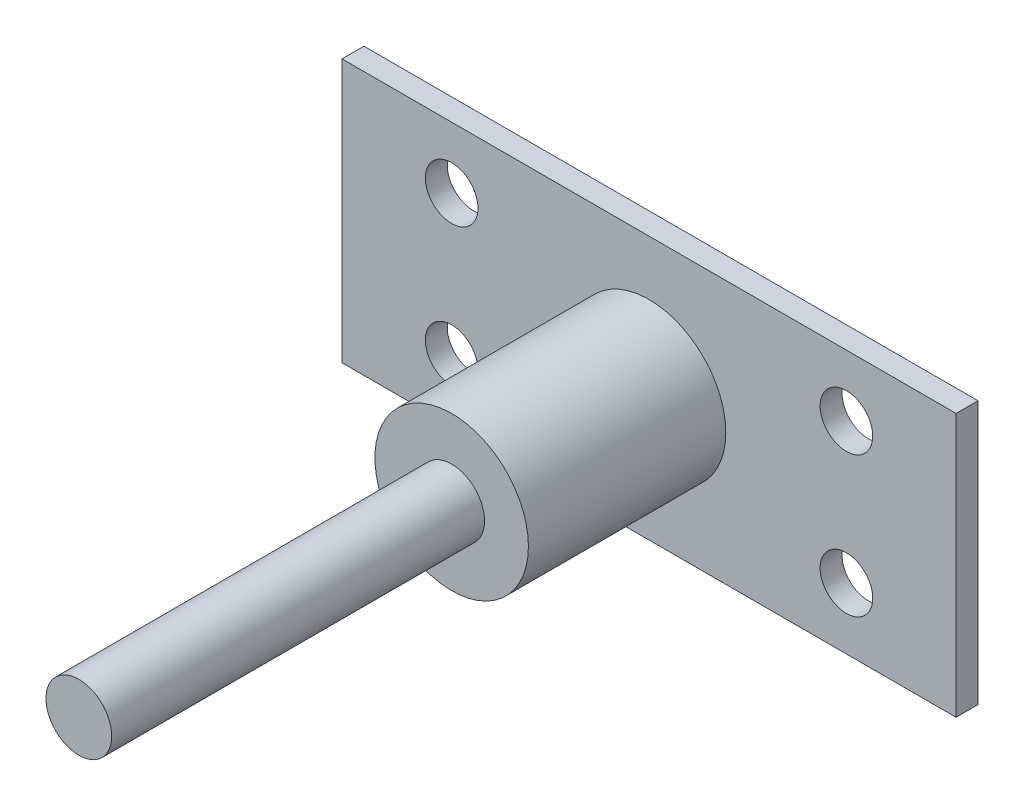
ISO-10303-21;
HEADER;
FILE_DESCRIPTION(('STEP AP214'),'2;1');
FILE_NAME('part.step','',(''),(''),'','','');
FILE_SCHEMA(('AUTOMOTIVE_DESIGN { 1 0 10303 214 1 1 1 1 }'));
ENDSEC;
DATA;
#1=APPLICATION_CONTEXT('core data for automotive mechanical design processes');
#2=APPLICATION_PROTOCOL_DEFINITION('international standard','automotive_design',2000,#1);
#3=PRODUCT_CONTEXT('',#1,'mechanical');
#4=PRODUCT('Part','Part','',(#3));
#5=PRODUCT_RELATED_PRODUCT_CATEGORY('part','',(#4));
#6=PRODUCT_DEFINITION_FORMATION('','',#4);
#7=PRODUCT_DEFINITION_CONTEXT('part definition',#1,'design');
#8=PRODUCT_DEFINITION('design','',#6,#7);
#9=PRODUCT_DEFINITION_SHAPE('','',#8);
#10=(LENGTH_UNIT() NAMED_UNIT(*) SI_UNIT(.MILLI.,.METRE.));
#11=(NAMED_UNIT(*) PLANE_ANGLE_UNIT() SI_UNIT($,.RADIAN.));
#12=(NAMED_UNIT(*) SI_UNIT($,.STERADIAN.) SOLID_ANGLE_UNIT());
#13=UNCERTAINTY_MEASURE_WITH_UNIT(LENGTH_MEASURE(1.E-05),#10,'distance_accuracy_value','');
#14=(GEOMETRIC_REPRESENTATION_CONTEXT(3) GLOBAL_UNCERTAINTY_ASSIGNED_CONTEXT((#13)) GLOBAL_UNIT_ASSIGNED_CONTEXT((#10,
#11,#12)) REPRESENTATION_CONTEXT('',''));
#15=CARTESIAN_POINT('',(0.,0.,0.));
#16=DIRECTION('',(0.,0.,1.));
#17=DIRECTION('',(1.,0.,0.));
#18=AXIS2_PLACEMENT_3D('',#15,#16,#17);
#19=CARTESIAN_POINT('',(0.,0.,5.));
#20=DIRECTION('',(0.,0.,1.));
#21=DIRECTION('',(1.,0.,0.));
#22=AXIS2_PLACEMENT_3D('',#19,#20,#21);
#23=PLANE('',#22);
#24=CARTESIAN_POINT('',(0.,0.,5.));
#25=DIRECTION('',(0.,0.,1.));
#26=DIRECTION('',(1.,0.,0.));
#27=AXIS2_PLACEMENT_3D('',#24,#25,#26);
#28=CIRCLE('',#27,17.5);
#29=CARTESIAN_POINT('',(17.5,0.,5.));
#30=VERTEX_POINT('',#29);
#31=EDGE_CURVE('E52',#30,#30,#28,.T.);
#32=ORIENTED_EDGE('',*,*,#31,.F.);
#33=EDGE_LOOP('',(#32));
#34=FACE_BOUND('',#33,.T.);
#35=CARTESIAN_POINT('',(45.,16.,5.));
#36=DIRECTION('',(0.,0.,1.));
#37=DIRECTION('',(1.,0.,0.));
#38=AXIS2_PLACEMENT_3D('',#35,#36,#37);
#39=CIRCLE('',#38,6.);
#40=CARTESIAN_POINT('',(51.,16.,5.));
#41=VERTEX_POINT('',#40);
#42=EDGE_CURVE('E151',#41,#41,#39,.T.);
#43=ORIENTED_EDGE('',*,*,#42,.F.);
#44=EDGE_LOOP('',(#43));
#45=FACE_BOUND('',#44,.T.);
#46=CARTESIAN_POINT('',(-45.,16.,5.));
#47=DIRECTION('',(0.,0.,1.));
#48=DIRECTION('',(1.,0.,0.));
#49=AXIS2_PLACEMENT_3D('',#46,#47,#48);
#50=CIRCLE('',#49,6.);
#51=CARTESIAN_POINT('',(-39.,16.,5.));
#52=VERTEX_POINT('',#51);
#53=EDGE_CURVE('E119',#52,#52,#50,.T.);
#54=ORIENTED_EDGE('',*,*,#53,.F.);
#55=EDGE_LOOP('',(#54));
#56=FACE_BOUND('',#55,.T.);
#57=DIRECTION('',(0.,1.,0.));
#58=VECTOR('',#57,1.);
#59=CARTESIAN_POINT('',(70.,30.,5.));
#60=LINE('',#59,#58);
#61=CARTESIAN_POINT('',(70.,-30.,5.));
#62=VERTEX_POINT('',#61);
#63=CARTESIAN_POINT('',(70.,30.,5.));
#64=VERTEX_POINT('',#63);
#65=EDGE_CURVE('E97',#62,#64,#60,.T.);
#66=ORIENTED_EDGE('',*,*,#65,.T.);
#67=DIRECTION('',(-1.,0.,0.));
#68=VECTOR('',#67,1.);
#69=CARTESIAN_POINT('',(-70.,30.,5.));
#70=LINE('',#69,#68);
#71=CARTESIAN_POINT('',(-70.,30.,5.));
#72=VERTEX_POINT('',#71);
#73=EDGE_CURVE('E92',#64,#72,#70,.T.);
#74=ORIENTED_EDGE('',*,*,#73,.T.);
#75=DIRECTION('',(0.,-1.,0.));
#76=VECTOR('',#75,1.);
#77=CARTESIAN_POINT('',(-70.,30.,5.));
#78=LINE('',#77,#76);
#79=CARTESIAN_POINT('',(-70.,-30.,5.));
#80=VERTEX_POINT('',#79);
#81=EDGE_CURVE('E95',#72,#80,#78,.T.);
#82=ORIENTED_EDGE('',*,*,#81,.T.);
#83=DIRECTION('',(1.,0.,0.));
#84=VECTOR('',#83,1.);
#85=CARTESIAN_POINT('',(-70.,-30.,5.));
#86=LINE('',#85,#84);
#87=EDGE_CURVE('E61',#80,#62,#86,.T.);
#88=ORIENTED_EDGE('',*,*,#87,.T.);
#89=EDGE_LOOP('',(#66,#74,#82,#88));
#90=FACE_BOUND('',#89,.T.);
#91=CARTESIAN_POINT('',(-45.,-16.,5.));
#92=DIRECTION('',(0.,0.,1.));
#93=DIRECTION('',(1.,0.,0.));
#94=AXIS2_PLACEMENT_3D('',#91,#92,#93);
#95=CIRCLE('',#94,5.99999999999999);
#96=CARTESIAN_POINT('',(-39.,-16.,5.));
#97=VERTEX_POINT('',#96);
#98=EDGE_CURVE('E143',#97,#97,#95,.T.);
#99=ORIENTED_EDGE('',*,*,#98,.F.);
#100=EDGE_LOOP('',(#99));
#101=FACE_BOUND('',#100,.T.);
#102=CARTESIAN_POINT('',(45.,-16.,5.));
#103=DIRECTION('',(0.,0.,1.));
#104=DIRECTION('',(1.,0.,0.));
#105=AXIS2_PLACEMENT_3D('',#102,#103,#104);
#106=CIRCLE('',#105,5.99999999999999);
#107=CARTESIAN_POINT('',(51.,-16.,5.));
#108=VERTEX_POINT('',#107);
#109=EDGE_CURVE('E159',#108,#108,#106,.T.);
#110=ORIENTED_EDGE('',*,*,#109,.F.);
#111=EDGE_LOOP('',(#110));
#112=FACE_BOUND('',#111,.T.);
#113=ADVANCED_FACE('F41',(#34,#45,#56,#90,#101,#112),#23,.T.);
#114=CARTESIAN_POINT('',(0.,0.,0.));
#115=DIRECTION('',(0.,0.,1.));
#116=DIRECTION('',(1.,0.,0.));
#117=AXIS2_PLACEMENT_3D('',#114,#115,#116);
#118=PLANE('',#117);
#119=DIRECTION('',(0.,1.,0.));
#120=VECTOR('',#119,1.);
#121=CARTESIAN_POINT('',(70.,30.,0.));
#122=LINE('',#121,#120);
#123=CARTESIAN_POINT('',(70.,-30.,0.));
#124=VERTEX_POINT('',#123);
#125=CARTESIAN_POINT('',(70.,30.,0.));
#126=VERTEX_POINT('',#125);
#127=EDGE_CURVE('E115',#124,#126,#122,.T.);
#128=ORIENTED_EDGE('',*,*,#127,.F.);
#129=DIRECTION('',(1.,0.,0.));
#130=VECTOR('',#129,1.);
#131=CARTESIAN_POINT('',(-70.,-30.,0.));
#132=LINE('',#131,#130);
#133=CARTESIAN_POINT('',(-70.,-30.,0.));
#134=VERTEX_POINT('',#133);
#135=EDGE_CURVE('E84',#134,#124,#132,.T.);
#136=ORIENTED_EDGE('',*,*,#135,.F.);
#137=DIRECTION('',(0.,-1.,0.));
#138=VECTOR('',#137,1.);
#139=CARTESIAN_POINT('',(-70.,30.,0.));
#140=LINE('',#139,#138);
#141=CARTESIAN_POINT('',(-70.,30.,0.));
#142=VERTEX_POINT('',#141);
#143=EDGE_CURVE('E78',#142,#134,#140,.T.);
#144=ORIENTED_EDGE('',*,*,#143,.F.);
#145=DIRECTION('',(-1.,0.,0.));
#146=VECTOR('',#145,1.);
#147=CARTESIAN_POINT('',(-70.,30.,0.));
#148=LINE('',#147,#146);
#149=EDGE_CURVE('E103',#126,#142,#148,.T.);
#150=ORIENTED_EDGE('',*,*,#149,.F.);
#151=EDGE_LOOP('',(#128,#136,#144,#150));
#152=FACE_BOUND('',#151,.T.);
#153=CARTESIAN_POINT('',(-45.,16.,0.));
#154=DIRECTION('',(0.,0.,1.));
#155=DIRECTION('',(1.,0.,0.));
#156=AXIS2_PLACEMENT_3D('',#153,#154,#155);
#157=CIRCLE('',#156,6.);
#158=CARTESIAN_POINT('',(-39.,16.,0.));
#159=VERTEX_POINT('',#158);
#160=EDGE_CURVE('E139',#159,#159,#157,.T.);
#161=ORIENTED_EDGE('',*,*,#160,.T.);
#162=EDGE_LOOP('',(#161));
#163=FACE_BOUND('',#162,.T.);
#164=CARTESIAN_POINT('',(-45.,-16.,0.));
#165=DIRECTION('',(0.,0.,1.));
#166=DIRECTION('',(1.,0.,0.));
#167=AXIS2_PLACEMENT_3D('',#164,#165,#166);
#168=CIRCLE('',#167,5.99999999999999);
#169=CARTESIAN_POINT('',(-39.,-16.,0.));
#170=VERTEX_POINT('',#169);
#171=EDGE_CURVE('E147',#170,#170,#168,.T.);
#172=ORIENTED_EDGE('',*,*,#171,.T.);
#173=EDGE_LOOP('',(#172));
#174=FACE_BOUND('',#173,.T.);
#175=CARTESIAN_POINT('',(45.,16.,0.));
#176=DIRECTION('',(0.,0.,1.));
#177=DIRECTION('',(1.,0.,0.));
#178=AXIS2_PLACEMENT_3D('',#175,#176,#177);
#179=CIRCLE('',#178,6.);
#180=CARTESIAN_POINT('',(51.,16.,0.));
#181=VERTEX_POINT('',#180);
#182=EDGE_CURVE('E155',#181,#181,#179,.T.);
#183=ORIENTED_EDGE('',*,*,#182,.T.);
#184=EDGE_LOOP('',(#183));
#185=FACE_BOUND('',#184,.T.);
#186=CARTESIAN_POINT('',(45.,-16.,0.));
#187=DIRECTION('',(0.,0.,1.));
#188=DIRECTION('',(1.,0.,0.));
#189=AXIS2_PLACEMENT_3D('',#186,#187,#188);
#190=CIRCLE('',#189,5.99999999999999);
#191=CARTESIAN_POINT('',(51.,-16.,0.));
#192=VERTEX_POINT('',#191);
#193=EDGE_CURVE('E163',#192,#192,#190,.T.);
#194=ORIENTED_EDGE('',*,*,#193,.T.);
#195=EDGE_LOOP('',(#194));
#196=FACE_BOUND('',#195,.T.);
#197=ADVANCED_FACE('F133',(#152,#163,#174,#185,#196),#118,.F.);
#198=CARTESIAN_POINT('',(70.,30.,5.));
#199=DIRECTION('',(-1.,0.,0.));
#200=DIRECTION('',(0.,-1.,0.));
#201=AXIS2_PLACEMENT_3D('',#198,#199,#200);
#202=PLANE('',#201);
#203=ORIENTED_EDGE('',*,*,#127,.T.);
#204=DIRECTION('',(0.,0.,-1.));
#205=VECTOR('',#204,1.);
#206=CARTESIAN_POINT('',(70.,30.,5.));
#207=LINE('',#206,#205);
#208=EDGE_CURVE('E45',#64,#126,#207,.T.);
#209=ORIENTED_EDGE('',*,*,#208,.F.);
#210=ORIENTED_EDGE('',*,*,#65,.F.);
#211=DIRECTION('',(0.,0.,-1.));
#212=VECTOR('',#211,1.);
#213=CARTESIAN_POINT('',(70.,-30.,5.));
#214=LINE('',#213,#212);
#215=EDGE_CURVE('E111',#62,#124,#214,.T.);
#216=ORIENTED_EDGE('',*,*,#215,.T.);
#217=EDGE_LOOP('',(#203,#209,#210,#216));
#218=FACE_BOUND('',#217,.T.);
#219=ADVANCED_FACE('F43',(#218),#202,.F.);
#220=CARTESIAN_POINT('',(-70.,30.,5.));
#221=DIRECTION('',(0.,-1.,0.));
#222=DIRECTION('',(0.,0.,-1.));
#223=AXIS2_PLACEMENT_3D('',#220,#221,#222);
#224=PLANE('',#223);
#225=ORIENTED_EDGE('',*,*,#149,.T.);
#226=DIRECTION('',(0.,0.,-1.));
#227=VECTOR('',#226,1.);
#228=CARTESIAN_POINT('',(-70.,30.,5.));
#229=LINE('',#228,#227);
#230=EDGE_CURVE('E101',#72,#142,#229,.T.);
#231=ORIENTED_EDGE('',*,*,#230,.F.);
#232=ORIENTED_EDGE('',*,*,#73,.F.);
#233=ORIENTED_EDGE('',*,*,#208,.T.);
#234=EDGE_LOOP('',(#225,#231,#232,#233));
#235=FACE_BOUND('',#234,.T.);
#236=ADVANCED_FACE('F102',(#235),#224,.F.);
#237=CARTESIAN_POINT('',(-70.,30.,5.));
#238=DIRECTION('',(1.,0.,0.));
#239=DIRECTION('',(0.,1.,0.));
#240=AXIS2_PLACEMENT_3D('',#237,#238,#239);
#241=PLANE('',#240);
#242=ORIENTED_EDGE('',*,*,#143,.T.);
#243=DIRECTION('',(0.,0.,-1.));
#244=VECTOR('',#243,1.);
#245=CARTESIAN_POINT('',(-70.,-30.,5.));
#246=LINE('',#245,#244);
#247=EDGE_CURVE('E105',#80,#134,#246,.T.);
#248=ORIENTED_EDGE('',*,*,#247,.F.);
#249=ORIENTED_EDGE('',*,*,#81,.F.);
#250=ORIENTED_EDGE('',*,*,#230,.T.);
#251=EDGE_LOOP('',(#242,#248,#249,#250));
#252=FACE_BOUND('',#251,.T.);
#253=ADVANCED_FACE('F106',(#252),#241,.F.);
#254=CARTESIAN_POINT('',(-70.,-30.,5.));
#255=DIRECTION('',(0.,1.,0.));
#256=DIRECTION('',(0.,0.,1.));
#257=AXIS2_PLACEMENT_3D('',#254,#255,#256);
#258=PLANE('',#257);
#259=ORIENTED_EDGE('',*,*,#135,.T.);
#260=ORIENTED_EDGE('',*,*,#215,.F.);
#261=ORIENTED_EDGE('',*,*,#87,.F.);
#262=ORIENTED_EDGE('',*,*,#247,.T.);
#263=EDGE_LOOP('',(#259,#260,#261,#262));
#264=FACE_BOUND('',#263,.T.);
#265=ADVANCED_FACE('F130',(#264),#258,.F.);
#266=CARTESIAN_POINT('',(-45.,16.,5.));
#267=DIRECTION('',(0.,0.,-1.));
#268=DIRECTION('',(-1.,0.,0.));
#269=AXIS2_PLACEMENT_3D('',#266,#267,#268);
#270=CYLINDRICAL_SURFACE('',#269,6.);
#271=ORIENTED_EDGE('',*,*,#53,.T.);
#272=EDGE_LOOP('',(#271));
#273=FACE_BOUND('',#272,.T.);
#274=ORIENTED_EDGE('',*,*,#160,.F.);
#275=EDGE_LOOP('',(#274));
#276=FACE_BOUND('',#275,.T.);
#277=ADVANCED_FACE('F211',(#273,#276),#270,.F.);
#278=CARTESIAN_POINT('',(-45.,-16.,5.));
#279=DIRECTION('',(0.,0.,-1.));
#280=DIRECTION('',(-1.,0.,0.));
#281=AXIS2_PLACEMENT_3D('',#278,#279,#280);
#282=CYLINDRICAL_SURFACE('',#281,5.99999999999999);
#283=ORIENTED_EDGE('',*,*,#98,.T.);
#284=EDGE_LOOP('',(#283));
#285=FACE_BOUND('',#284,.T.);
#286=ORIENTED_EDGE('',*,*,#171,.F.);
#287=EDGE_LOOP('',(#286));
#288=FACE_BOUND('',#287,.T.);
#289=ADVANCED_FACE('F214',(#285,#288),#282,.F.);
#290=CARTESIAN_POINT('',(45.,16.,5.));
#291=DIRECTION('',(0.,0.,-1.));
#292=DIRECTION('',(-1.,0.,0.));
#293=AXIS2_PLACEMENT_3D('',#290,#291,#292);
#294=CYLINDRICAL_SURFACE('',#293,6.);
#295=ORIENTED_EDGE('',*,*,#42,.T.);
#296=EDGE_LOOP('',(#295));
#297=FACE_BOUND('',#296,.T.);
#298=ORIENTED_EDGE('',*,*,#182,.F.);
#299=EDGE_LOOP('',(#298));
#300=FACE_BOUND('',#299,.T.);
#301=ADVANCED_FACE('F227',(#297,#300),#294,.F.);
#302=CARTESIAN_POINT('',(45.,-16.,5.));
#303=DIRECTION('',(0.,0.,-1.));
#304=DIRECTION('',(-1.,0.,0.));
#305=AXIS2_PLACEMENT_3D('',#302,#303,#304);
#306=CYLINDRICAL_SURFACE('',#305,5.99999999999999);
#307=ORIENTED_EDGE('',*,*,#109,.T.);
#308=EDGE_LOOP('',(#307));
#309=FACE_BOUND('',#308,.T.);
#310=ORIENTED_EDGE('',*,*,#193,.F.);
#311=EDGE_LOOP('',(#310));
#312=FACE_BOUND('',#311,.T.);
#313=ADVANCED_FACE('F200',(#309,#312),#306,.F.);
#314=CARTESIAN_POINT('',(0.,0.,50.));
#315=DIRECTION('',(0.,0.,-1.));
#316=DIRECTION('',(-1.,0.,0.));
#317=AXIS2_PLACEMENT_3D('',#314,#315,#316);
#318=CYLINDRICAL_SURFACE('',#317,17.5);
#319=CARTESIAN_POINT('',(0.,0.,50.));
#320=DIRECTION('',(0.,0.,1.));
#321=DIRECTION('',(1.,0.,0.));
#322=AXIS2_PLACEMENT_3D('',#319,#320,#321);
#323=CIRCLE('',#322,17.5);
#324=CARTESIAN_POINT('',(17.5,0.,50.));
#325=VERTEX_POINT('',#324);
#326=EDGE_CURVE('E167',#325,#325,#323,.T.);
#327=ORIENTED_EDGE('',*,*,#326,.F.);
#328=EDGE_LOOP('',(#327));
#329=FACE_BOUND('',#328,.T.);
#330=ORIENTED_EDGE('',*,*,#31,.T.);
#331=EDGE_LOOP('',(#330));
#332=FACE_BOUND('',#331,.T.);
#333=ADVANCED_FACE('F194',(#329,#332),#318,.T.);
#334=CARTESIAN_POINT('',(0.,0.,50.));
#335=DIRECTION('',(0.,0.,1.));
#336=DIRECTION('',(1.,0.,0.));
#337=AXIS2_PLACEMENT_3D('',#334,#335,#336);
#338=PLANE('',#337);
#339=CARTESIAN_POINT('',(0.,0.,50.));
#340=DIRECTION('',(0.,0.,1.));
#341=DIRECTION('',(1.,0.,0.));
#342=AXIS2_PLACEMENT_3D('',#339,#340,#341);
#343=CIRCLE('',#342,7.5);
#344=CARTESIAN_POINT('',(7.5,0.,50.));
#345=VERTEX_POINT('',#344);
#346=EDGE_CURVE('E11',#345,#345,#343,.T.);
#347=ORIENTED_EDGE('',*,*,#346,.F.);
#348=EDGE_LOOP('',(#347));
#349=FACE_BOUND('',#348,.T.);
#350=ORIENTED_EDGE('',*,*,#326,.T.);
#351=EDGE_LOOP('',(#350));
#352=FACE_BOUND('',#351,.T.);
#353=ADVANCED_FACE('F188',(#349,#352),#338,.T.);
#354=CARTESIAN_POINT('',(0.,0.,135.));
#355=DIRECTION('',(0.,0.,-1.));
#356=DIRECTION('',(-1.,0.,0.));
#357=AXIS2_PLACEMENT_3D('',#354,#355,#356);
#358=CYLINDRICAL_SURFACE('',#357,7.5);
#359=CARTESIAN_POINT('',(0.,0.,135.));
#360=DIRECTION('',(0.,0.,1.));
#361=DIRECTION('',(1.,0.,0.));
#362=AXIS2_PLACEMENT_3D('',#359,#360,#361);
#363=CIRCLE('',#362,7.5);
#364=CARTESIAN_POINT('',(7.5,0.,135.));
#365=VERTEX_POINT('',#364);
#366=EDGE_CURVE('E176',#365,#365,#363,.T.);
#367=ORIENTED_EDGE('',*,*,#366,.F.);
#368=EDGE_LOOP('',(#367));
#369=FACE_BOUND('',#368,.T.);
#370=ORIENTED_EDGE('',*,*,#346,.T.);
#371=EDGE_LOOP('',(#370));
#372=FACE_BOUND('',#371,.T.);
#373=ADVANCED_FACE('F185',(#369,#372),#358,.T.);
#374=CARTESIAN_POINT('',(0.,0.,135.));
#375=DIRECTION('',(0.,0.,1.));
#376=DIRECTION('',(1.,0.,0.));
#377=AXIS2_PLACEMENT_3D('',#374,#375,#376);
#378=PLANE('',#377);
#379=ORIENTED_EDGE('',*,*,#366,.T.);
#380=EDGE_LOOP('',(#379));
#381=FACE_BOUND('',#380,.T.);
#382=ADVANCED_FACE('F183',(#381),#378,.T.);
#383=CLOSED_SHELL('',(#113,#197,#219,#236,#253,#265,#277,#289,#301,#313,#333,#353,#373,#382));
#384=MANIFOLD_SOLID_BREP('B2',#383);
#385=ADVANCED_BREP_SHAPE_REPRESENTATION('',(#18,#384),#14);
#386=SHAPE_DEFINITION_REPRESENTATION(#9,#385);
ENDSEC;
END-ISO-10303-21;
